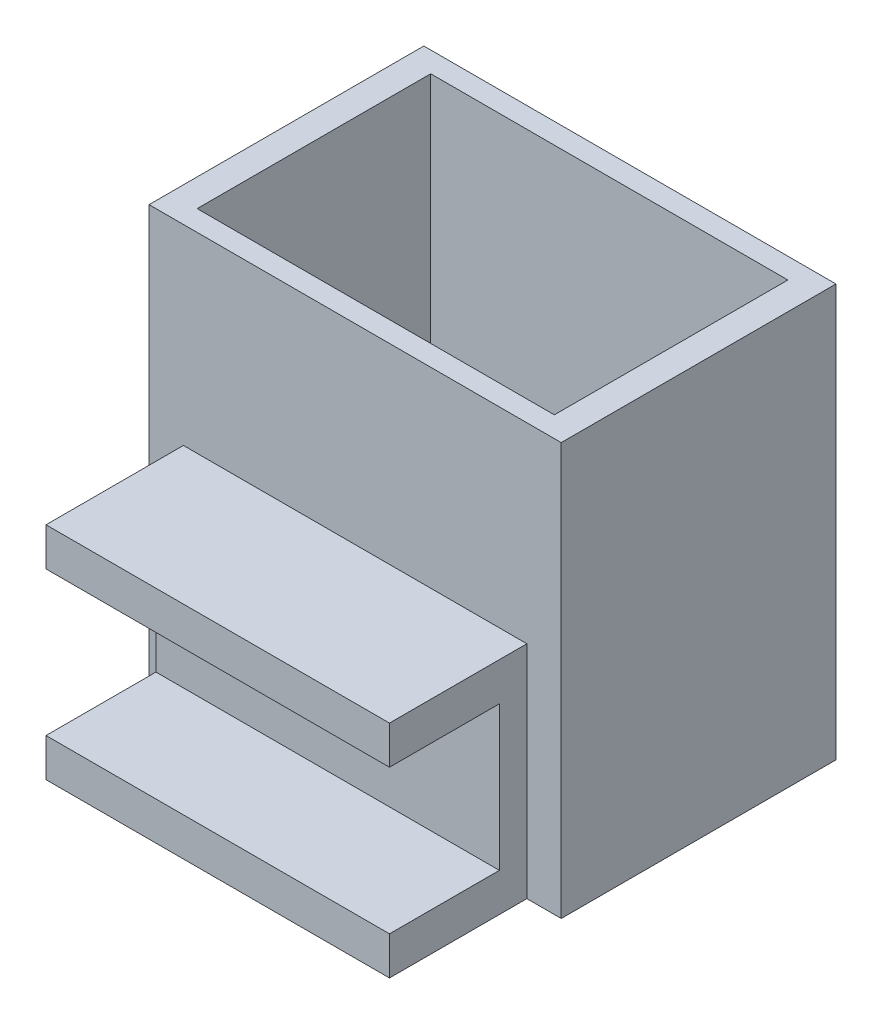
ISO-10303-21;
HEADER;
FILE_DESCRIPTION(('STEP AP214'),'2;1');
FILE_NAME('part.step','',(''),(''),'','','');
FILE_SCHEMA(('AUTOMOTIVE_DESIGN { 1 0 10303 214 1 1 1 1 }'));
ENDSEC;
DATA;
#1=APPLICATION_CONTEXT('core data for automotive mechanical design processes');
#2=APPLICATION_PROTOCOL_DEFINITION('international standard','automotive_design',2000,#1);
#3=PRODUCT_CONTEXT('',#1,'mechanical');
#4=PRODUCT('Part','Part','',(#3));
#5=PRODUCT_RELATED_PRODUCT_CATEGORY('part','',(#4));
#6=PRODUCT_DEFINITION_FORMATION('','',#4);
#7=PRODUCT_DEFINITION_CONTEXT('part definition',#1,'design');
#8=PRODUCT_DEFINITION('design','',#6,#7);
#9=PRODUCT_DEFINITION_SHAPE('','',#8);
#10=(LENGTH_UNIT() NAMED_UNIT(*) SI_UNIT(.MILLI.,.METRE.));
#11=(NAMED_UNIT(*) PLANE_ANGLE_UNIT() SI_UNIT($,.RADIAN.));
#12=(NAMED_UNIT(*) SI_UNIT($,.STERADIAN.) SOLID_ANGLE_UNIT());
#13=UNCERTAINTY_MEASURE_WITH_UNIT(LENGTH_MEASURE(1.E-05),#10,'distance_accuracy_value','');
#14=(GEOMETRIC_REPRESENTATION_CONTEXT(3) GLOBAL_UNCERTAINTY_ASSIGNED_CONTEXT((#13)) GLOBAL_UNIT_ASSIGNED_CONTEXT((#10,
#11,#12)) REPRESENTATION_CONTEXT('',''));
#15=CARTESIAN_POINT('',(0.,0.,0.));
#16=DIRECTION('',(0.,0.,1.));
#17=DIRECTION('',(1.,0.,0.));
#18=AXIS2_PLACEMENT_3D('',#15,#16,#17);
#19=CARTESIAN_POINT('',(0.,0.,17.8164556962025));
#20=DIRECTION('',(0.,0.,1.));
#21=DIRECTION('',(1.,0.,0.));
#22=AXIS2_PLACEMENT_3D('',#19,#20,#21);
#23=PLANE('',#22);
#24=DIRECTION('',(-1.,0.,0.));
#25=VECTOR('',#24,1.);
#26=CARTESIAN_POINT('',(0.,13.285,17.8164556962025));
#27=LINE('',#26,#25);
#28=CARTESIAN_POINT('',(12.1285070776469,13.285,17.8164556962025));
#29=VERTEX_POINT('',#28);
#30=CARTESIAN_POINT('',(-12.8714929223531,13.285,17.8164556962025));
#31=VERTEX_POINT('',#30);
#32=EDGE_CURVE('E11',#29,#31,#27,.T.);
#33=ORIENTED_EDGE('',*,*,#32,.F.);
#34=DIRECTION('',(0.,1.,0.));
#35=VECTOR('',#34,1.);
#36=CARTESIAN_POINT('',(12.1285070776469,0.,17.8164556962025));
#37=LINE('',#36,#35);
#38=CARTESIAN_POINT('',(12.1285070776469,16.07,17.8164556962025));
#39=VERTEX_POINT('',#38);
#40=EDGE_CURVE('E176',#29,#39,#37,.T.);
#41=ORIENTED_EDGE('',*,*,#40,.T.);
#42=DIRECTION('',(-1.,0.,0.));
#43=VECTOR('',#42,1.);
#44=CARTESIAN_POINT('',(12.1285070776469,16.07,17.8164556962025));
#45=LINE('',#44,#43);
#46=CARTESIAN_POINT('',(-12.8714929223531,16.07,17.8164556962025));
#47=VERTEX_POINT('',#46);
#48=EDGE_CURVE('E195',#39,#47,#45,.T.);
#49=ORIENTED_EDGE('',*,*,#48,.T.);
#50=DIRECTION('',(0.,-1.,0.));
#51=VECTOR('',#50,1.);
#52=CARTESIAN_POINT('',(-12.8714929223531,16.07,17.8164556962025));
#53=LINE('',#52,#51);
#54=EDGE_CURVE('E311',#47,#31,#53,.T.);
#55=ORIENTED_EDGE('',*,*,#54,.T.);
#56=EDGE_LOOP('',(#33,#41,#49,#55));
#57=FACE_BOUND('',#56,.T.);
#58=ADVANCED_FACE('F38',(#57),#23,.T.);
#59=CARTESIAN_POINT('',(-15.3714929223531,30.,7.81645569620254));
#60=DIRECTION('',(0.,0.,-1.));
#61=DIRECTION('',(-1.,0.,0.));
#62=AXIS2_PLACEMENT_3D('',#59,#60,#61);
#63=PLANE('',#62);
#64=DIRECTION('',(0.,1.,0.));
#65=VECTOR('',#64,1.);
#66=CARTESIAN_POINT('',(12.1285070776469,0.,7.81645569620254));
#67=LINE('',#66,#65);
#68=CARTESIAN_POINT('',(12.1285070776469,0.,7.81645569620254));
#69=VERTEX_POINT('',#68);
#70=CARTESIAN_POINT('',(12.1285070776469,16.07,7.81645569620254));
#71=VERTEX_POINT('',#70);
#72=EDGE_CURVE('E193',#69,#71,#67,.T.);
#73=ORIENTED_EDGE('',*,*,#72,.F.);
#74=DIRECTION('',(1.,0.,0.));
#75=VECTOR('',#74,1.);
#76=CARTESIAN_POINT('',(-15.3714929223531,0.,7.81645569620254));
#77=LINE('',#76,#75);
#78=CARTESIAN_POINT('',(14.6285070776469,0.,7.81645569620254));
#79=VERTEX_POINT('',#78);
#80=EDGE_CURVE('E270',#69,#79,#77,.T.);
#81=ORIENTED_EDGE('',*,*,#80,.T.);
#82=DIRECTION('',(0.,-1.,0.));
#83=VECTOR('',#82,1.);
#84=CARTESIAN_POINT('',(14.6285070776469,30.,7.81645569620254));
#85=LINE('',#84,#83);
#86=CARTESIAN_POINT('',(14.6285070776469,30.,7.81645569620254));
#87=VERTEX_POINT('',#86);
#88=EDGE_CURVE('E286',#87,#79,#85,.T.);
#89=ORIENTED_EDGE('',*,*,#88,.F.);
#90=DIRECTION('',(1.,0.,0.));
#91=VECTOR('',#90,1.);
#92=CARTESIAN_POINT('',(-15.3714929223531,30.,7.81645569620254));
#93=LINE('',#92,#91);
#94=CARTESIAN_POINT('',(-15.3714929223531,30.,7.81645569620254));
#95=VERTEX_POINT('',#94);
#96=EDGE_CURVE('E256',#95,#87,#93,.T.);
#97=ORIENTED_EDGE('',*,*,#96,.F.);
#98=DIRECTION('',(0.,-1.,0.));
#99=VECTOR('',#98,1.);
#100=CARTESIAN_POINT('',(-15.3714929223531,30.,7.81645569620254));
#101=LINE('',#100,#99);
#102=CARTESIAN_POINT('',(-15.3714929223531,0.,7.81645569620254));
#103=VERTEX_POINT('',#102);
#104=EDGE_CURVE('E158',#95,#103,#101,.T.);
#105=ORIENTED_EDGE('',*,*,#104,.T.);
#106=CARTESIAN_POINT('',(-12.8714929223531,0.,7.81645569620254));
#107=VERTEX_POINT('',#106);
#108=EDGE_CURVE('E271',#103,#107,#77,.T.);
#109=ORIENTED_EDGE('',*,*,#108,.T.);
#110=DIRECTION('',(0.,-1.,0.));
#111=VECTOR('',#110,1.);
#112=CARTESIAN_POINT('',(-12.8714929223531,16.07,7.81645569620254));
#113=LINE('',#112,#111);
#114=CARTESIAN_POINT('',(-12.8714929223531,16.07,7.81645569620254));
#115=VERTEX_POINT('',#114);
#116=EDGE_CURVE('E188',#115,#107,#113,.T.);
#117=ORIENTED_EDGE('',*,*,#116,.F.);
#118=DIRECTION('',(-1.,0.,0.));
#119=VECTOR('',#118,1.);
#120=CARTESIAN_POINT('',(12.1285070776469,16.07,7.81645569620254));
#121=LINE('',#120,#119);
#122=EDGE_CURVE('E62',#71,#115,#121,.T.);
#123=ORIENTED_EDGE('',*,*,#122,.F.);
#124=EDGE_LOOP('',(#73,#81,#89,#97,#105,#109,#117,#123));
#125=FACE_BOUND('',#124,.T.);
#126=ADVANCED_FACE('F293',(#125),#63,.F.);
#127=CARTESIAN_POINT('',(-15.3714929223531,30.,-12.1835443037975));
#128=DIRECTION('',(1.,0.,0.));
#129=DIRECTION('',(0.,0.,-1.));
#130=AXIS2_PLACEMENT_3D('',#127,#128,#129);
#131=PLANE('',#130);
#132=DIRECTION('',(0.,0.,1.));
#133=VECTOR('',#132,1.);
#134=CARTESIAN_POINT('',(-15.3714929223531,0.,-12.1835443037975));
#135=LINE('',#134,#133);
#136=CARTESIAN_POINT('',(-15.3714929223531,0.,-12.1835443037975));
#137=VERTEX_POINT('',#136);
#138=EDGE_CURVE('E242',#137,#103,#135,.T.);
#139=ORIENTED_EDGE('',*,*,#138,.T.);
#140=ORIENTED_EDGE('',*,*,#104,.F.);
#141=DIRECTION('',(0.,0.,1.));
#142=VECTOR('',#141,1.);
#143=CARTESIAN_POINT('',(-15.3714929223531,30.,-12.1835443037975));
#144=LINE('',#143,#142);
#145=CARTESIAN_POINT('',(-15.3714929223531,30.,-12.1835443037975));
#146=VERTEX_POINT('',#145);
#147=EDGE_CURVE('E252',#146,#95,#144,.T.);
#148=ORIENTED_EDGE('',*,*,#147,.F.);
#149=DIRECTION('',(0.,-1.,0.));
#150=VECTOR('',#149,1.);
#151=CARTESIAN_POINT('',(-15.3714929223531,30.,-12.1835443037975));
#152=LINE('',#151,#150);
#153=EDGE_CURVE('E266',#146,#137,#152,.T.);
#154=ORIENTED_EDGE('',*,*,#153,.T.);
#155=EDGE_LOOP('',(#139,#140,#148,#154));
#156=FACE_BOUND('',#155,.T.);
#157=ADVANCED_FACE('F40',(#156),#131,.F.);
#158=CARTESIAN_POINT('',(14.6285070776469,30.,-12.1835443037975));
#159=DIRECTION('',(-1.,0.,0.));
#160=DIRECTION('',(0.,0.,1.));
#161=AXIS2_PLACEMENT_3D('',#158,#159,#160);
#162=PLANE('',#161);
#163=DIRECTION('',(0.,0.,-1.));
#164=VECTOR('',#163,1.);
#165=CARTESIAN_POINT('',(14.6285070776469,0.,-12.1835443037975));
#166=LINE('',#165,#164);
#167=CARTESIAN_POINT('',(14.6285070776469,0.,-12.1835443037975));
#168=VERTEX_POINT('',#167);
#169=EDGE_CURVE('E274',#79,#168,#166,.T.);
#170=ORIENTED_EDGE('',*,*,#169,.T.);
#171=DIRECTION('',(0.,-1.,0.));
#172=VECTOR('',#171,1.);
#173=CARTESIAN_POINT('',(14.6285070776469,30.,-12.1835443037975));
#174=LINE('',#173,#172);
#175=CARTESIAN_POINT('',(14.6285070776469,30.,-12.1835443037975));
#176=VERTEX_POINT('',#175);
#177=EDGE_CURVE('E282',#176,#168,#174,.T.);
#178=ORIENTED_EDGE('',*,*,#177,.F.);
#179=DIRECTION('',(0.,0.,-1.));
#180=VECTOR('',#179,1.);
#181=CARTESIAN_POINT('',(14.6285070776469,30.,-12.1835443037975));
#182=LINE('',#181,#180);
#183=EDGE_CURVE('E260',#87,#176,#182,.T.);
#184=ORIENTED_EDGE('',*,*,#183,.F.);
#185=ORIENTED_EDGE('',*,*,#88,.T.);
#186=EDGE_LOOP('',(#170,#178,#184,#185));
#187=FACE_BOUND('',#186,.T.);
#188=ADVANCED_FACE('F321',(#187),#162,.F.);
#189=CARTESIAN_POINT('',(-15.3714929223531,30.,-12.1835443037975));
#190=DIRECTION('',(0.,0.,1.));
#191=DIRECTION('',(1.,0.,0.));
#192=AXIS2_PLACEMENT_3D('',#189,#190,#191);
#193=PLANE('',#192);
#194=DIRECTION('',(-1.,0.,0.));
#195=VECTOR('',#194,1.);
#196=CARTESIAN_POINT('',(-15.3714929223531,0.,-12.1835443037975));
#197=LINE('',#196,#195);
#198=EDGE_CURVE('E257',#168,#137,#197,.T.);
#199=ORIENTED_EDGE('',*,*,#198,.T.);
#200=ORIENTED_EDGE('',*,*,#153,.F.);
#201=DIRECTION('',(-1.,0.,0.));
#202=VECTOR('',#201,1.);
#203=CARTESIAN_POINT('',(-15.3714929223531,30.,-12.1835443037975));
#204=LINE('',#203,#202);
#205=EDGE_CURVE('E263',#176,#146,#204,.T.);
#206=ORIENTED_EDGE('',*,*,#205,.F.);
#207=ORIENTED_EDGE('',*,*,#177,.T.);
#208=EDGE_LOOP('',(#199,#200,#206,#207));
#209=FACE_BOUND('',#208,.T.);
#210=ADVANCED_FACE('F325',(#209),#193,.F.);
#211=CARTESIAN_POINT('',(0.,30.,0.));
#212=DIRECTION('',(0.,1.,0.));
#213=DIRECTION('',(0.,0.,1.));
#214=AXIS2_PLACEMENT_3D('',#211,#212,#213);
#215=PLANE('',#214);
#216=DIRECTION('',(0.,0.,1.));
#217=VECTOR('',#216,1.);
#218=CARTESIAN_POINT('',(-13.3714929223531,30.,-10.6835443037975));
#219=LINE('',#218,#217);
#220=CARTESIAN_POINT('',(-13.3714929223531,30.,-10.6835443037975));
#221=VERTEX_POINT('',#220);
#222=CARTESIAN_POINT('',(-13.3714929223531,30.,6.31645569620253));
#223=VERTEX_POINT('',#222);
#224=EDGE_CURVE('E207',#221,#223,#219,.T.);
#225=ORIENTED_EDGE('',*,*,#224,.F.);
#226=DIRECTION('',(-1.,0.,0.));
#227=VECTOR('',#226,1.);
#228=CARTESIAN_POINT('',(-13.3714929223531,30.,-10.6835443037975));
#229=LINE('',#228,#227);
#230=CARTESIAN_POINT('',(12.6285070776469,30.,-10.6835443037975));
#231=VERTEX_POINT('',#230);
#232=EDGE_CURVE('E213',#231,#221,#229,.T.);
#233=ORIENTED_EDGE('',*,*,#232,.F.);
#234=DIRECTION('',(0.,0.,-1.));
#235=VECTOR('',#234,1.);
#236=CARTESIAN_POINT('',(12.6285070776469,30.,-10.6835443037975));
#237=LINE('',#236,#235);
#238=CARTESIAN_POINT('',(12.6285070776469,30.,6.31645569620253));
#239=VERTEX_POINT('',#238);
#240=EDGE_CURVE('E232',#239,#231,#237,.T.);
#241=ORIENTED_EDGE('',*,*,#240,.F.);
#242=DIRECTION('',(1.,0.,0.));
#243=VECTOR('',#242,1.);
#244=CARTESIAN_POINT('',(-13.3714929223531,30.,6.31645569620253));
#245=LINE('',#244,#243);
#246=EDGE_CURVE('E228',#223,#239,#245,.T.);
#247=ORIENTED_EDGE('',*,*,#246,.F.);
#248=EDGE_LOOP('',(#225,#233,#241,#247));
#249=FACE_BOUND('',#248,.T.);
#250=ORIENTED_EDGE('',*,*,#147,.T.);
#251=ORIENTED_EDGE('',*,*,#96,.T.);
#252=ORIENTED_EDGE('',*,*,#183,.T.);
#253=ORIENTED_EDGE('',*,*,#205,.T.);
#254=EDGE_LOOP('',(#250,#251,#252,#253));
#255=FACE_BOUND('',#254,.T.);
#256=ADVANCED_FACE('F327',(#249,#255),#215,.T.);
#257=CARTESIAN_POINT('',(0.,0.,0.));
#258=DIRECTION('',(0.,1.,0.));
#259=DIRECTION('',(0.,0.,1.));
#260=AXIS2_PLACEMENT_3D('',#257,#258,#259);
#261=PLANE('',#260);
#262=ORIENTED_EDGE('',*,*,#138,.F.);
#263=ORIENTED_EDGE('',*,*,#198,.F.);
#264=ORIENTED_EDGE('',*,*,#169,.F.);
#265=ORIENTED_EDGE('',*,*,#80,.F.);
#266=DIRECTION('',(0.,0.,-1.));
#267=VECTOR('',#266,1.);
#268=CARTESIAN_POINT('',(12.1285070776469,0.,17.8164556962025));
#269=LINE('',#268,#267);
#270=CARTESIAN_POINT('',(12.1285070776469,0.,17.8164556962025));
#271=VERTEX_POINT('',#270);
#272=EDGE_CURVE('E181',#271,#69,#269,.T.);
#273=ORIENTED_EDGE('',*,*,#272,.F.);
#274=DIRECTION('',(1.,0.,0.));
#275=VECTOR('',#274,1.);
#276=CARTESIAN_POINT('',(-12.8714929223531,0.,17.8164556962025));
#277=LINE('',#276,#275);
#278=CARTESIAN_POINT('',(-12.8714929223531,0.,17.8164556962025));
#279=VERTEX_POINT('',#278);
#280=EDGE_CURVE('E172',#279,#271,#277,.T.);
#281=ORIENTED_EDGE('',*,*,#280,.F.);
#282=DIRECTION('',(0.,0.,-1.));
#283=VECTOR('',#282,1.);
#284=CARTESIAN_POINT('',(-12.8714929223531,0.,17.8164556962025));
#285=LINE('',#284,#283);
#286=EDGE_CURVE('E199',#279,#107,#285,.T.);
#287=ORIENTED_EDGE('',*,*,#286,.T.);
#288=ORIENTED_EDGE('',*,*,#108,.F.);
#289=EDGE_LOOP('',(#262,#263,#264,#265,#273,#281,#287,#288));
#290=FACE_BOUND('',#289,.T.);
#291=ADVANCED_FACE('F301',(#290),#261,.F.);
#292=CARTESIAN_POINT('',(-13.3714929223531,5.,-10.6835443037975));
#293=DIRECTION('',(-1.,0.,0.));
#294=DIRECTION('',(0.,0.,1.));
#295=AXIS2_PLACEMENT_3D('',#292,#293,#294);
#296=PLANE('',#295);
#297=ORIENTED_EDGE('',*,*,#224,.T.);
#298=DIRECTION('',(0.,1.,0.));
#299=VECTOR('',#298,1.);
#300=CARTESIAN_POINT('',(-13.3714929223531,5.,6.31645569620253));
#301=LINE('',#300,#299);
#302=CARTESIAN_POINT('',(-13.3714929223531,5.,6.31645569620253));
#303=VERTEX_POINT('',#302);
#304=EDGE_CURVE('E225',#303,#223,#301,.T.);
#305=ORIENTED_EDGE('',*,*,#304,.F.);
#306=DIRECTION('',(0.,0.,1.));
#307=VECTOR('',#306,1.);
#308=CARTESIAN_POINT('',(-13.3714929223531,5.,-10.6835443037975));
#309=LINE('',#308,#307);
#310=CARTESIAN_POINT('',(-13.3714929223531,5.,-10.6835443037975));
#311=VERTEX_POINT('',#310);
#312=EDGE_CURVE('E208',#311,#303,#309,.T.);
#313=ORIENTED_EDGE('',*,*,#312,.F.);
#314=DIRECTION('',(0.,1.,0.));
#315=VECTOR('',#314,1.);
#316=CARTESIAN_POINT('',(-13.3714929223531,5.,-10.6835443037975));
#317=LINE('',#316,#315);
#318=EDGE_CURVE('E239',#311,#221,#317,.T.);
#319=ORIENTED_EDGE('',*,*,#318,.T.);
#320=EDGE_LOOP('',(#297,#305,#313,#319));
#321=FACE_BOUND('',#320,.T.);
#322=ADVANCED_FACE('F335',(#321),#296,.F.);
#323=CARTESIAN_POINT('',(-13.3714929223531,5.,-10.6835443037975));
#324=DIRECTION('',(0.,0.,-1.));
#325=DIRECTION('',(-1.,0.,0.));
#326=AXIS2_PLACEMENT_3D('',#323,#324,#325);
#327=PLANE('',#326);
#328=ORIENTED_EDGE('',*,*,#232,.T.);
#329=ORIENTED_EDGE('',*,*,#318,.F.);
#330=DIRECTION('',(-1.,0.,0.));
#331=VECTOR('',#330,1.);
#332=CARTESIAN_POINT('',(-13.3714929223531,5.,-10.6835443037975));
#333=LINE('',#332,#331);
#334=CARTESIAN_POINT('',(12.6285070776469,5.,-10.6835443037975));
#335=VERTEX_POINT('',#334);
#336=EDGE_CURVE('E221',#335,#311,#333,.T.);
#337=ORIENTED_EDGE('',*,*,#336,.F.);
#338=DIRECTION('',(0.,1.,0.));
#339=VECTOR('',#338,1.);
#340=CARTESIAN_POINT('',(12.6285070776469,5.,-10.6835443037975));
#341=LINE('',#340,#339);
#342=EDGE_CURVE('E243',#335,#231,#341,.T.);
#343=ORIENTED_EDGE('',*,*,#342,.T.);
#344=EDGE_LOOP('',(#328,#329,#337,#343));
#345=FACE_BOUND('',#344,.T.);
#346=ADVANCED_FACE('F370',(#345),#327,.F.);
#347=CARTESIAN_POINT('',(12.6285070776469,5.,-10.6835443037975));
#348=DIRECTION('',(1.,0.,0.));
#349=DIRECTION('',(0.,0.,-1.));
#350=AXIS2_PLACEMENT_3D('',#347,#348,#349);
#351=PLANE('',#350);
#352=ORIENTED_EDGE('',*,*,#240,.T.);
#353=ORIENTED_EDGE('',*,*,#342,.F.);
#354=DIRECTION('',(0.,0.,-1.));
#355=VECTOR('',#354,1.);
#356=CARTESIAN_POINT('',(12.6285070776469,5.,-10.6835443037975));
#357=LINE('',#356,#355);
#358=CARTESIAN_POINT('',(12.6285070776469,5.,6.31645569620253));
#359=VERTEX_POINT('',#358);
#360=EDGE_CURVE('E217',#359,#335,#357,.T.);
#361=ORIENTED_EDGE('',*,*,#360,.F.);
#362=DIRECTION('',(0.,1.,0.));
#363=VECTOR('',#362,1.);
#364=CARTESIAN_POINT('',(12.6285070776469,5.,6.31645569620253));
#365=LINE('',#364,#363);
#366=EDGE_CURVE('E246',#359,#239,#365,.T.);
#367=ORIENTED_EDGE('',*,*,#366,.T.);
#368=EDGE_LOOP('',(#352,#353,#361,#367));
#369=FACE_BOUND('',#368,.T.);
#370=ADVANCED_FACE('F373',(#369),#351,.F.);
#371=CARTESIAN_POINT('',(-13.3714929223531,5.,6.31645569620253));
#372=DIRECTION('',(0.,0.,1.));
#373=DIRECTION('',(1.,0.,0.));
#374=AXIS2_PLACEMENT_3D('',#371,#372,#373);
#375=PLANE('',#374);
#376=ORIENTED_EDGE('',*,*,#246,.T.);
#377=ORIENTED_EDGE('',*,*,#366,.F.);
#378=DIRECTION('',(1.,0.,0.));
#379=VECTOR('',#378,1.);
#380=CARTESIAN_POINT('',(-13.3714929223531,5.,6.31645569620253));
#381=LINE('',#380,#379);
#382=EDGE_CURVE('E212',#303,#359,#381,.T.);
#383=ORIENTED_EDGE('',*,*,#382,.F.);
#384=ORIENTED_EDGE('',*,*,#304,.T.);
#385=EDGE_LOOP('',(#376,#377,#383,#384));
#386=FACE_BOUND('',#385,.T.);
#387=ADVANCED_FACE('F368',(#386),#375,.F.);
#388=CARTESIAN_POINT('',(0.,5.,0.));
#389=DIRECTION('',(0.,1.,0.));
#390=DIRECTION('',(0.,0.,1.));
#391=AXIS2_PLACEMENT_3D('',#388,#389,#390);
#392=PLANE('',#391);
#393=ORIENTED_EDGE('',*,*,#312,.T.);
#394=ORIENTED_EDGE('',*,*,#382,.T.);
#395=ORIENTED_EDGE('',*,*,#360,.T.);
#396=ORIENTED_EDGE('',*,*,#336,.T.);
#397=EDGE_LOOP('',(#393,#394,#395,#396));
#398=FACE_BOUND('',#397,.T.);
#399=ADVANCED_FACE('F365',(#398),#392,.T.);
#400=CARTESIAN_POINT('',(12.1285070776469,16.07,17.8164556962025));
#401=DIRECTION('',(0.,-1.,0.));
#402=DIRECTION('',(1.,0.,0.));
#403=AXIS2_PLACEMENT_3D('',#400,#401,#402);
#404=PLANE('',#403);
#405=ORIENTED_EDGE('',*,*,#122,.T.);
#406=DIRECTION('',(0.,0.,-1.));
#407=VECTOR('',#406,1.);
#408=CARTESIAN_POINT('',(-12.8714929223531,16.07,17.8164556962025));
#409=LINE('',#408,#407);
#410=EDGE_CURVE('E203',#47,#115,#409,.T.);
#411=ORIENTED_EDGE('',*,*,#410,.F.);
#412=ORIENTED_EDGE('',*,*,#48,.F.);
#413=DIRECTION('',(0.,0.,-1.));
#414=VECTOR('',#413,1.);
#415=CARTESIAN_POINT('',(12.1285070776469,16.07,17.8164556962025));
#416=LINE('',#415,#414);
#417=EDGE_CURVE('E175',#39,#71,#416,.T.);
#418=ORIENTED_EDGE('',*,*,#417,.T.);
#419=EDGE_LOOP('',(#405,#411,#412,#418));
#420=FACE_BOUND('',#419,.T.);
#421=ADVANCED_FACE('F315',(#420),#404,.F.);
#422=CARTESIAN_POINT('',(-12.8714929223531,16.07,17.8164556962025));
#423=DIRECTION('',(1.,0.,0.));
#424=DIRECTION('',(0.,1.,0.));
#425=AXIS2_PLACEMENT_3D('',#422,#423,#424);
#426=PLANE('',#425);
#427=DIRECTION('',(0.,1.,0.));
#428=VECTOR('',#427,1.);
#429=CARTESIAN_POINT('',(-12.8714929223531,16.07,9.81645569620254));
#430=LINE('',#429,#428);
#431=CARTESIAN_POINT('',(-12.8714929223531,2.785,9.81645569620253));
#432=VERTEX_POINT('',#431);
#433=CARTESIAN_POINT('',(-12.8714929223531,13.285,9.81645569620254));
#434=VERTEX_POINT('',#433);
#435=EDGE_CURVE('E189',#432,#434,#430,.T.);
#436=ORIENTED_EDGE('',*,*,#435,.T.);
#437=DIRECTION('',(0.,0.,1.));
#438=VECTOR('',#437,1.);
#439=CARTESIAN_POINT('',(-12.8714929223531,13.285,17.8164556962025));
#440=LINE('',#439,#438);
#441=EDGE_CURVE('E457',#434,#31,#440,.T.);
#442=ORIENTED_EDGE('',*,*,#441,.T.);
#443=ORIENTED_EDGE('',*,*,#54,.F.);
#444=ORIENTED_EDGE('',*,*,#410,.T.);
#445=ORIENTED_EDGE('',*,*,#116,.T.);
#446=ORIENTED_EDGE('',*,*,#286,.F.);
#447=CARTESIAN_POINT('',(-12.8714929223531,2.785,17.8164556962025));
#448=VERTEX_POINT('',#447);
#449=EDGE_CURVE('E307',#448,#279,#53,.T.);
#450=ORIENTED_EDGE('',*,*,#449,.F.);
#451=DIRECTION('',(0.,0.,-1.));
#452=VECTOR('',#451,1.);
#453=CARTESIAN_POINT('',(-12.8714929223531,2.785,17.8164556962025));
#454=LINE('',#453,#452);
#455=EDGE_CURVE('E54',#448,#432,#454,.T.);
#456=ORIENTED_EDGE('',*,*,#455,.T.);
#457=EDGE_LOOP('',(#436,#442,#443,#444,#445,#446,#450,#456));
#458=FACE_BOUND('',#457,.T.);
#459=ADVANCED_FACE('F306',(#458),#426,.F.);
#460=CARTESIAN_POINT('',(12.1285070776469,0.,17.8164556962025));
#461=DIRECTION('',(-1.,0.,0.));
#462=DIRECTION('',(0.,-1.,0.));
#463=AXIS2_PLACEMENT_3D('',#460,#461,#462);
#464=PLANE('',#463);
#465=ORIENTED_EDGE('',*,*,#40,.F.);
#466=DIRECTION('',(0.,0.,1.));
#467=VECTOR('',#466,1.);
#468=CARTESIAN_POINT('',(12.1285070776469,13.285,17.8164556962025));
#469=LINE('',#468,#467);
#470=CARTESIAN_POINT('',(12.1285070776469,13.285,9.81645569620254));
#471=VERTEX_POINT('',#470);
#472=EDGE_CURVE('E456',#471,#29,#469,.T.);
#473=ORIENTED_EDGE('',*,*,#472,.F.);
#474=DIRECTION('',(0.,1.,0.));
#475=VECTOR('',#474,1.);
#476=CARTESIAN_POINT('',(12.1285070776469,13.285,9.81645569620254));
#477=LINE('',#476,#475);
#478=CARTESIAN_POINT('',(12.1285070776469,2.785,9.81645569620253));
#479=VERTEX_POINT('',#478);
#480=EDGE_CURVE('E167',#479,#471,#477,.T.);
#481=ORIENTED_EDGE('',*,*,#480,.F.);
#482=DIRECTION('',(0.,0.,-1.));
#483=VECTOR('',#482,1.);
#484=CARTESIAN_POINT('',(12.1285070776469,2.785,9.81645569620253));
#485=LINE('',#484,#483);
#486=CARTESIAN_POINT('',(12.1285070776469,2.785,17.8164556962025));
#487=VERTEX_POINT('',#486);
#488=EDGE_CURVE('E152',#487,#479,#485,.T.);
#489=ORIENTED_EDGE('',*,*,#488,.F.);
#490=EDGE_CURVE('E164',#271,#487,#37,.T.);
#491=ORIENTED_EDGE('',*,*,#490,.F.);
#492=ORIENTED_EDGE('',*,*,#272,.T.);
#493=ORIENTED_EDGE('',*,*,#72,.T.);
#494=ORIENTED_EDGE('',*,*,#417,.F.);
#495=EDGE_LOOP('',(#465,#473,#481,#489,#491,#492,#493,#494));
#496=FACE_BOUND('',#495,.T.);
#497=ADVANCED_FACE('F162',(#496),#464,.F.);
#498=DIRECTION('',(1.,0.,0.));
#499=VECTOR('',#498,1.);
#500=CARTESIAN_POINT('',(0.,2.785,17.8164556962025));
#501=LINE('',#500,#499);
#502=EDGE_CURVE('E47',#448,#487,#501,.T.);
#503=ORIENTED_EDGE('',*,*,#502,.F.);
#504=ORIENTED_EDGE('',*,*,#449,.T.);
#505=ORIENTED_EDGE('',*,*,#280,.T.);
#506=ORIENTED_EDGE('',*,*,#490,.T.);
#507=EDGE_LOOP('',(#503,#504,#505,#506));
#508=FACE_BOUND('',#507,.T.);
#509=ADVANCED_FACE('F170',(#508),#23,.T.);
#510=CARTESIAN_POINT('',(-15.3714929223531,13.285,9.81645569620254));
#511=DIRECTION('',(0.,0.,-1.));
#512=DIRECTION('',(0.,1.,0.));
#513=AXIS2_PLACEMENT_3D('',#510,#511,#512);
#514=PLANE('',#513);
#515=DIRECTION('',(1.,0.,0.));
#516=VECTOR('',#515,1.);
#517=CARTESIAN_POINT('',(-15.3714929223531,2.785,9.81645569620253));
#518=LINE('',#517,#516);
#519=EDGE_CURVE('E459',#432,#479,#518,.T.);
#520=ORIENTED_EDGE('',*,*,#519,.T.);
#521=ORIENTED_EDGE('',*,*,#480,.T.);
#522=DIRECTION('',(1.,0.,0.));
#523=VECTOR('',#522,1.);
#524=CARTESIAN_POINT('',(-15.3714929223531,13.285,9.81645569620254));
#525=LINE('',#524,#523);
#526=EDGE_CURVE('E455',#434,#471,#525,.T.);
#527=ORIENTED_EDGE('',*,*,#526,.F.);
#528=ORIENTED_EDGE('',*,*,#435,.F.);
#529=EDGE_LOOP('',(#520,#521,#527,#528));
#530=FACE_BOUND('',#529,.T.);
#531=ADVANCED_FACE('F350',(#530),#514,.F.);
#532=CARTESIAN_POINT('',(-15.3714929223531,13.285,17.8164556962025));
#533=DIRECTION('',(0.,1.,0.));
#534=DIRECTION('',(-1.,0.,0.));
#535=AXIS2_PLACEMENT_3D('',#532,#533,#534);
#536=PLANE('',#535);
#537=ORIENTED_EDGE('',*,*,#526,.T.);
#538=ORIENTED_EDGE('',*,*,#472,.T.);
#539=ORIENTED_EDGE('',*,*,#32,.T.);
#540=ORIENTED_EDGE('',*,*,#441,.F.);
#541=EDGE_LOOP('',(#537,#538,#539,#540));
#542=FACE_BOUND('',#541,.T.);
#543=ADVANCED_FACE('F355',(#542),#536,.F.);
#544=CARTESIAN_POINT('',(-15.3714929223531,2.785,9.81645569620253));
#545=DIRECTION('',(0.,-1.,0.));
#546=DIRECTION('',(0.,0.,-1.));
#547=AXIS2_PLACEMENT_3D('',#544,#545,#546);
#548=PLANE('',#547);
#549=ORIENTED_EDGE('',*,*,#502,.T.);
#550=ORIENTED_EDGE('',*,*,#488,.T.);
#551=ORIENTED_EDGE('',*,*,#519,.F.);
#552=ORIENTED_EDGE('',*,*,#455,.F.);
#553=EDGE_LOOP('',(#549,#550,#551,#552));
#554=FACE_BOUND('',#553,.T.);
#555=ADVANCED_FACE('F151',(#554),#548,.F.);
#556=CLOSED_SHELL('',(#58,#126,#157,#188,#210,#256,#291,#322,#346,#370,#387,#399,#421,#459,#497,
#509,#531,#543,#555));
#557=MANIFOLD_SOLID_BREP('B2',#556);
#558=ADVANCED_BREP_SHAPE_REPRESENTATION('',(#18,#557),#14);
#559=SHAPE_DEFINITION_REPRESENTATION(#9,#558);
ENDSEC;
END-ISO-10303-21;
